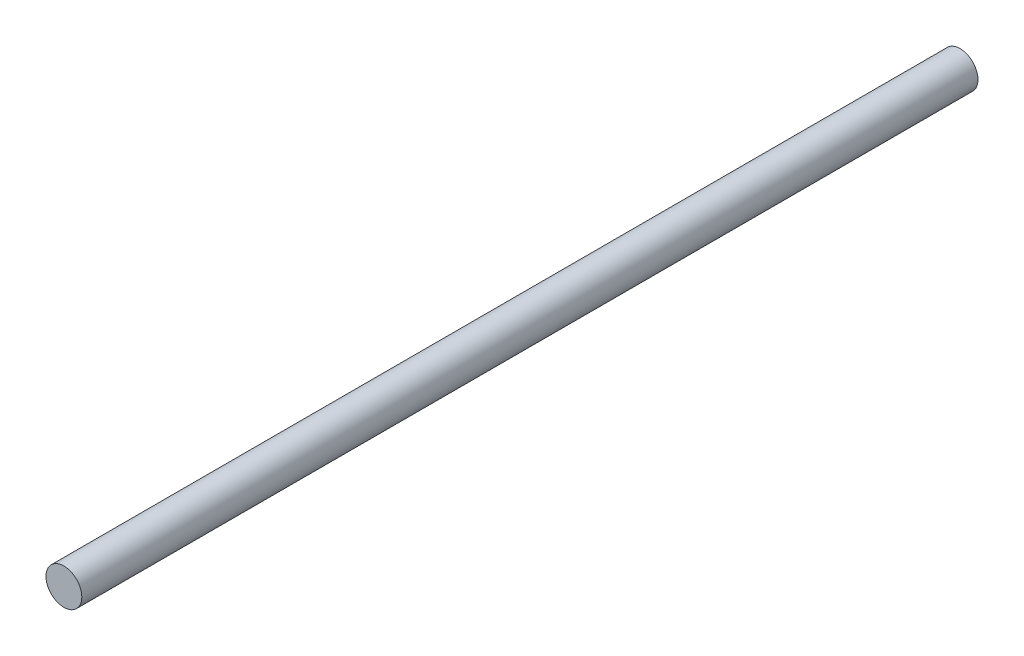
ISO-10303-21;
HEADER;
FILE_DESCRIPTION(('STEP AP214'),'2;1');
FILE_NAME('part.step','',(''),(''),'','','');
FILE_SCHEMA(('AUTOMOTIVE_DESIGN { 1 0 10303 214 1 1 1 1 }'));
ENDSEC;
DATA;
#1=APPLICATION_CONTEXT('core data for automotive mechanical design processes');
#2=APPLICATION_PROTOCOL_DEFINITION('international standard','automotive_design',2000,#1);
#3=PRODUCT_CONTEXT('',#1,'mechanical');
#4=PRODUCT('Part','Part','',(#3));
#5=PRODUCT_RELATED_PRODUCT_CATEGORY('part','',(#4));
#6=PRODUCT_DEFINITION_FORMATION('','',#4);
#7=PRODUCT_DEFINITION_CONTEXT('part definition',#1,'design');
#8=PRODUCT_DEFINITION('design','',#6,#7);
#9=PRODUCT_DEFINITION_SHAPE('','',#8);
#10=(LENGTH_UNIT() NAMED_UNIT(*) SI_UNIT(.MILLI.,.METRE.));
#11=(NAMED_UNIT(*) PLANE_ANGLE_UNIT() SI_UNIT($,.RADIAN.));
#12=(NAMED_UNIT(*) SI_UNIT($,.STERADIAN.) SOLID_ANGLE_UNIT());
#13=UNCERTAINTY_MEASURE_WITH_UNIT(LENGTH_MEASURE(1.E-05),#10,'distance_accuracy_value','');
#14=(GEOMETRIC_REPRESENTATION_CONTEXT(3) GLOBAL_UNCERTAINTY_ASSIGNED_CONTEXT((#13)) GLOBAL_UNIT_ASSIGNED_CONTEXT((#10,
#11,#12)) REPRESENTATION_CONTEXT('',''));
#15=CARTESIAN_POINT('',(0.,0.,0.));
#16=DIRECTION('',(0.,0.,1.));
#17=DIRECTION('',(1.,0.,0.));
#18=AXIS2_PLACEMENT_3D('',#15,#16,#17);
#19=CARTESIAN_POINT('',(0.,0.,62.5));
#20=DIRECTION('',(0.,0.,-1.));
#21=DIRECTION('',(-1.,0.,0.));
#22=AXIS2_PLACEMENT_3D('',#19,#20,#21);
#23=CYLINDRICAL_SURFACE('',#22,2.5);
#24=CARTESIAN_POINT('',(0.,0.,62.5));
#25=DIRECTION('',(0.,0.,1.));
#26=DIRECTION('',(1.,0.,0.));
#27=AXIS2_PLACEMENT_3D('',#24,#25,#26);
#28=CIRCLE('',#27,2.5);
#29=CARTESIAN_POINT('',(2.5,0.,62.5));
#30=VERTEX_POINT('',#29);
#31=EDGE_CURVE('E10',#30,#30,#28,.T.);
#32=ORIENTED_EDGE('',*,*,#31,.F.);
#33=EDGE_LOOP('',(#32));
#34=FACE_BOUND('',#33,.T.);
#35=CARTESIAN_POINT('',(0.,0.,-62.5));
#36=DIRECTION('',(0.,0.,1.));
#37=DIRECTION('',(1.,0.,0.));
#38=AXIS2_PLACEMENT_3D('',#35,#36,#37);
#39=CIRCLE('',#38,2.5);
#40=CARTESIAN_POINT('',(2.5,0.,-62.5));
#41=VERTEX_POINT('',#40);
#42=EDGE_CURVE('E35',#41,#41,#39,.T.);
#43=ORIENTED_EDGE('',*,*,#42,.T.);
#44=EDGE_LOOP('',(#43));
#45=FACE_BOUND('',#44,.T.);
#46=ADVANCED_FACE('F32',(#34,#45),#23,.T.);
#47=CARTESIAN_POINT('',(0.,0.,62.5));
#48=DIRECTION('',(0.,0.,1.));
#49=DIRECTION('',(1.,0.,0.));
#50=AXIS2_PLACEMENT_3D('',#47,#48,#49);
#51=PLANE('',#50);
#52=ORIENTED_EDGE('',*,*,#31,.T.);
#53=EDGE_LOOP('',(#52));
#54=FACE_BOUND('',#53,.T.);
#55=ADVANCED_FACE('F47',(#54),#51,.T.);
#56=CARTESIAN_POINT('',(0.,0.,-62.5));
#57=DIRECTION('',(0.,0.,1.));
#58=DIRECTION('',(1.,0.,0.));
#59=AXIS2_PLACEMENT_3D('',#56,#57,#58);
#60=PLANE('',#59);
#61=ORIENTED_EDGE('',*,*,#42,.F.);
#62=EDGE_LOOP('',(#61));
#63=FACE_BOUND('',#62,.T.);
#64=ADVANCED_FACE('F45',(#63),#60,.F.);
#65=CLOSED_SHELL('',(#46,#55,#64));
#66=MANIFOLD_SOLID_BREP('B2',#65);
#67=ADVANCED_BREP_SHAPE_REPRESENTATION('',(#18,#66),#14);
#68=SHAPE_DEFINITION_REPRESENTATION(#9,#67);
ENDSEC;
END-ISO-10303-21;
